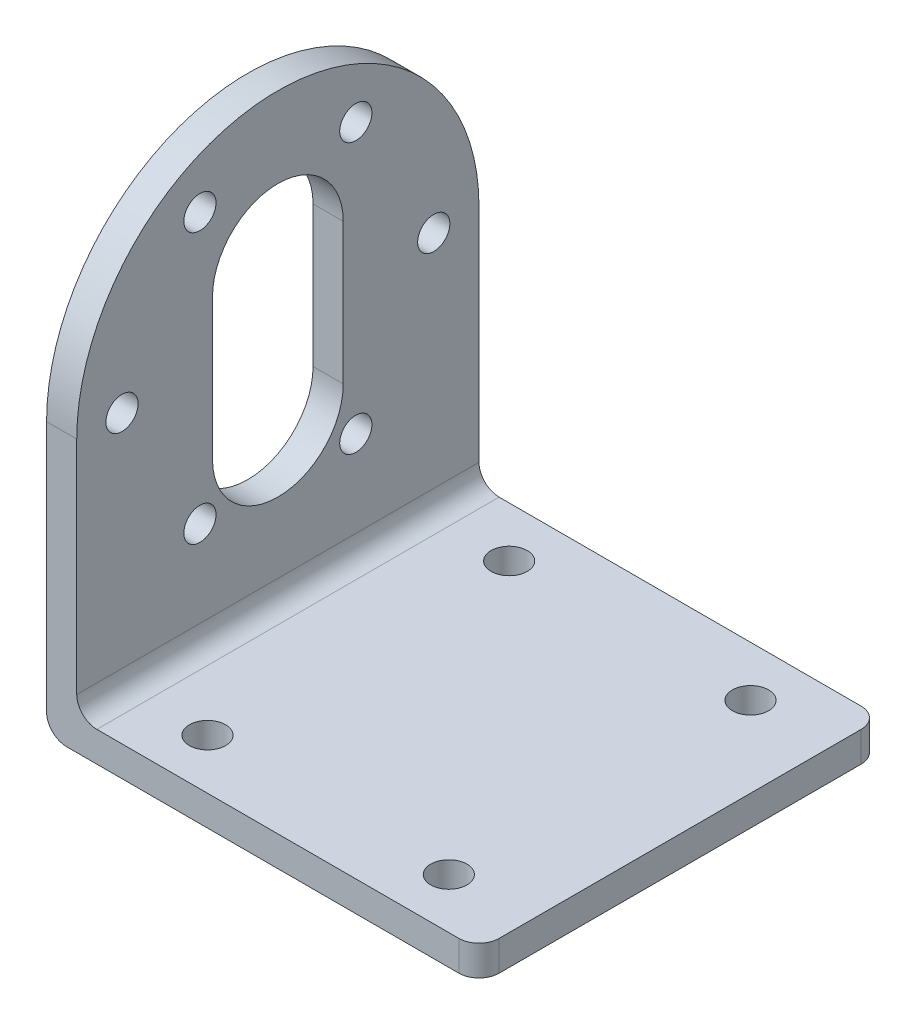
ISO-10303-21;
HEADER;
FILE_DESCRIPTION(('STEP AP214'),'2;1');
FILE_NAME('part.step','',(''),(''),'','','');
FILE_SCHEMA(('AUTOMOTIVE_DESIGN { 1 0 10303 214 1 1 1 1 }'));
ENDSEC;
DATA;
#1=APPLICATION_CONTEXT('core data for automotive mechanical design processes');
#2=APPLICATION_PROTOCOL_DEFINITION('international standard','automotive_design',2000,#1);
#3=PRODUCT_CONTEXT('',#1,'mechanical');
#4=PRODUCT('Part','Part','',(#3));
#5=PRODUCT_RELATED_PRODUCT_CATEGORY('part','',(#4));
#6=PRODUCT_DEFINITION_FORMATION('','',#4);
#7=PRODUCT_DEFINITION_CONTEXT('part definition',#1,'design');
#8=PRODUCT_DEFINITION('design','',#6,#7);
#9=PRODUCT_DEFINITION_SHAPE('','',#8);
#10=(LENGTH_UNIT() NAMED_UNIT(*) SI_UNIT(.MILLI.,.METRE.));
#11=(NAMED_UNIT(*) PLANE_ANGLE_UNIT() SI_UNIT($,.RADIAN.));
#12=(NAMED_UNIT(*) SI_UNIT($,.STERADIAN.) SOLID_ANGLE_UNIT());
#13=UNCERTAINTY_MEASURE_WITH_UNIT(LENGTH_MEASURE(1.E-05),#10,'distance_accuracy_value','');
#14=(GEOMETRIC_REPRESENTATION_CONTEXT(3) GLOBAL_UNCERTAINTY_ASSIGNED_CONTEXT((#13)) GLOBAL_UNIT_ASSIGNED_CONTEXT((#10,
#11,#12)) REPRESENTATION_CONTEXT('',''));
#15=CARTESIAN_POINT('',(0.,0.,0.));
#16=DIRECTION('',(0.,0.,1.));
#17=DIRECTION('',(1.,0.,0.));
#18=AXIS2_PLACEMENT_3D('',#15,#16,#17);
#19=CARTESIAN_POINT('',(3.,27.,0.));
#20=DIRECTION('',(-1.,0.,0.));
#21=DIRECTION('',(0.,0.,1.));
#22=AXIS2_PLACEMENT_3D('',#19,#20,#21);
#23=PLANE('',#22);
#24=CARTESIAN_POINT('',(3.,26.9999999999999,15.4999999999996));
#25=DIRECTION('',(1.,0.,0.));
#26=DIRECTION('',(0.,0.,-1.));
#27=AXIS2_PLACEMENT_3D('',#24,#25,#26);
#28=CIRCLE('',#27,1.6);
#29=CARTESIAN_POINT('',(3.,26.9999999999999,13.8999999999996));
#30=VERTEX_POINT('',#29);
#31=EDGE_CURVE('E187',#30,#30,#28,.T.);
#32=ORIENTED_EDGE('',*,*,#31,.F.);
#33=EDGE_LOOP('',(#32));
#34=FACE_BOUND('',#33,.T.);
#35=CARTESIAN_POINT('',(3.,13.5766062413413,7.74999999999934));
#36=DIRECTION('',(1.,0.,0.));
#37=DIRECTION('',(0.,0.,-1.));
#38=AXIS2_PLACEMENT_3D('',#35,#36,#37);
#39=CIRCLE('',#38,1.6);
#40=CARTESIAN_POINT('',(3.,13.5766062413413,6.14999999999934));
#41=VERTEX_POINT('',#40);
#42=EDGE_CURVE('E193',#41,#41,#39,.T.);
#43=ORIENTED_EDGE('',*,*,#42,.F.);
#44=EDGE_LOOP('',(#43));
#45=FACE_BOUND('',#44,.T.);
#46=CARTESIAN_POINT('',(3.,13.5766062413416,-7.75000000000069));
#47=DIRECTION('',(1.,0.,0.));
#48=DIRECTION('',(0.,0.,-1.));
#49=AXIS2_PLACEMENT_3D('',#46,#47,#48);
#50=CIRCLE('',#49,1.6);
#51=CARTESIAN_POINT('',(3.,13.5766062413416,-9.35000000000068));
#52=VERTEX_POINT('',#51);
#53=EDGE_CURVE('E199',#52,#52,#50,.T.);
#54=ORIENTED_EDGE('',*,*,#53,.F.);
#55=EDGE_LOOP('',(#54));
#56=FACE_BOUND('',#55,.T.);
#57=CARTESIAN_POINT('',(3.,27.0000000000006,-15.5000000000004));
#58=DIRECTION('',(1.,0.,0.));
#59=DIRECTION('',(0.,0.,-1.));
#60=AXIS2_PLACEMENT_3D('',#57,#58,#59);
#61=CIRCLE('',#60,1.6);
#62=CARTESIAN_POINT('',(3.,27.0000000000006,-17.1000000000004));
#63=VERTEX_POINT('',#62);
#64=EDGE_CURVE('E205',#63,#63,#61,.T.);
#65=ORIENTED_EDGE('',*,*,#64,.F.);
#66=EDGE_LOOP('',(#65));
#67=FACE_BOUND('',#66,.T.);
#68=CARTESIAN_POINT('',(3.,40.4233937586592,-7.75));
#69=DIRECTION('',(1.,0.,0.));
#70=DIRECTION('',(0.,0.,-1.));
#71=AXIS2_PLACEMENT_3D('',#68,#69,#70);
#72=CIRCLE('',#71,1.6);
#73=CARTESIAN_POINT('',(3.,40.4233937586592,-9.35));
#74=VERTEX_POINT('',#73);
#75=EDGE_CURVE('E211',#74,#74,#72,.T.);
#76=ORIENTED_EDGE('',*,*,#75,.F.);
#77=EDGE_LOOP('',(#76));
#78=FACE_BOUND('',#77,.T.);
#79=CARTESIAN_POINT('',(3.,40.4233937586588,7.75000000000002));
#80=DIRECTION('',(1.,0.,0.));
#81=DIRECTION('',(0.,0.,-1.));
#82=AXIS2_PLACEMENT_3D('',#79,#80,#81);
#83=CIRCLE('',#82,1.6);
#84=CARTESIAN_POINT('',(3.,40.4233937586588,6.15000000000003));
#85=VERTEX_POINT('',#84);
#86=EDGE_CURVE('E217',#85,#85,#83,.T.);
#87=ORIENTED_EDGE('',*,*,#86,.F.);
#88=EDGE_LOOP('',(#87));
#89=FACE_BOUND('',#88,.T.);
#90=CARTESIAN_POINT('',(3.,32.5,0.));
#91=DIRECTION('',(1.,0.,0.));
#92=DIRECTION('',(0.,0.,-1.));
#93=AXIS2_PLACEMENT_3D('',#90,#91,#92);
#94=CIRCLE('',#93,6.5);
#95=CARTESIAN_POINT('',(3.,32.5,-6.5));
#96=VERTEX_POINT('',#95);
#97=CARTESIAN_POINT('',(3.,32.5,6.5));
#98=VERTEX_POINT('',#97);
#99=EDGE_CURVE('E223',#96,#98,#94,.T.);
#100=ORIENTED_EDGE('',*,*,#99,.F.);
#101=DIRECTION('',(0.,1.,0.));
#102=VECTOR('',#101,1.);
#103=CARTESIAN_POINT('',(3.,32.5,-6.5));
#104=LINE('',#103,#102);
#105=CARTESIAN_POINT('',(3.,18.5,-6.5));
#106=VERTEX_POINT('',#105);
#107=EDGE_CURVE('E231',#106,#96,#104,.T.);
#108=ORIENTED_EDGE('',*,*,#107,.F.);
#109=CARTESIAN_POINT('',(3.,18.5,0.));
#110=DIRECTION('',(1.,0.,0.));
#111=DIRECTION('',(0.,0.,-1.));
#112=AXIS2_PLACEMENT_3D('',#109,#110,#111);
#113=CIRCLE('',#112,6.5);
#114=CARTESIAN_POINT('',(3.,18.5,6.5));
#115=VERTEX_POINT('',#114);
#116=EDGE_CURVE('E228',#115,#106,#113,.T.);
#117=ORIENTED_EDGE('',*,*,#116,.F.);
#118=DIRECTION('',(0.,-1.,0.));
#119=VECTOR('',#118,1.);
#120=CARTESIAN_POINT('',(3.,32.5,6.5));
#121=LINE('',#120,#119);
#122=EDGE_CURVE('E225',#98,#115,#121,.T.);
#123=ORIENTED_EDGE('',*,*,#122,.F.);
#124=EDGE_LOOP('',(#100,#108,#117,#123));
#125=FACE_BOUND('',#124,.T.);
#126=DIRECTION('',(0.,-1.,0.));
#127=VECTOR('',#126,1.);
#128=CARTESIAN_POINT('',(3.,0.,20.));
#129=LINE('',#128,#127);
#130=CARTESIAN_POINT('',(3.,27.,20.));
#131=VERTEX_POINT('',#130);
#132=CARTESIAN_POINT('',(3.,5.,20.));
#133=VERTEX_POINT('',#132);
#134=EDGE_CURVE('E259',#131,#133,#129,.T.);
#135=ORIENTED_EDGE('',*,*,#134,.T.);
#136=DIRECTION('',(0.,0.,1.));
#137=VECTOR('',#136,1.);
#138=CARTESIAN_POINT('',(3.,5.,-20.));
#139=LINE('',#138,#137);
#140=CARTESIAN_POINT('',(3.,5.,-20.));
#141=VERTEX_POINT('',#140);
#142=EDGE_CURVE('E279',#133,#141,#139,.F.);
#143=ORIENTED_EDGE('',*,*,#142,.T.);
#144=DIRECTION('',(0.,1.,0.));
#145=VECTOR('',#144,1.);
#146=CARTESIAN_POINT('',(3.,0.,-20.));
#147=LINE('',#146,#145);
#148=CARTESIAN_POINT('',(3.,27.,-20.));
#149=VERTEX_POINT('',#148);
#150=EDGE_CURVE('E254',#141,#149,#147,.T.);
#151=ORIENTED_EDGE('',*,*,#150,.T.);
#152=CARTESIAN_POINT('',(3.,27.,0.));
#153=DIRECTION('',(1.,0.,0.));
#154=DIRECTION('',(0.,0.,1.));
#155=AXIS2_PLACEMENT_3D('',#152,#153,#154);
#156=CIRCLE('',#155,20.);
#157=EDGE_CURVE('E256',#149,#131,#156,.T.);
#158=ORIENTED_EDGE('',*,*,#157,.T.);
#159=EDGE_LOOP('',(#135,#143,#151,#158));
#160=FACE_BOUND('',#159,.T.);
#161=ADVANCED_FACE('F37',(#34,#45,#56,#67,#78,#89,#125,#160),#23,.F.);
#162=CARTESIAN_POINT('',(0.,27.,0.));
#163=DIRECTION('',(-1.,0.,0.));
#164=DIRECTION('',(0.,0.,1.));
#165=AXIS2_PLACEMENT_3D('',#162,#163,#164);
#166=PLANE('',#165);
#167=DIRECTION('',(0.,1.,0.));
#168=VECTOR('',#167,1.);
#169=CARTESIAN_POINT('',(0.,0.,-20.));
#170=LINE('',#169,#168);
#171=CARTESIAN_POINT('',(0.,2.,-20.));
#172=VERTEX_POINT('',#171);
#173=CARTESIAN_POINT('',(0.,27.,-20.));
#174=VERTEX_POINT('',#173);
#175=EDGE_CURVE('E253',#172,#174,#170,.T.);
#176=ORIENTED_EDGE('',*,*,#175,.F.);
#177=DIRECTION('',(0.,0.,-1.));
#178=VECTOR('',#177,1.);
#179=CARTESIAN_POINT('',(0.,2.,20.));
#180=LINE('',#179,#178);
#181=CARTESIAN_POINT('',(0.,2.,20.));
#182=VERTEX_POINT('',#181);
#183=EDGE_CURVE('E52',#172,#182,#180,.F.);
#184=ORIENTED_EDGE('',*,*,#183,.T.);
#185=DIRECTION('',(0.,-1.,0.));
#186=VECTOR('',#185,1.);
#187=CARTESIAN_POINT('',(0.,0.,20.));
#188=LINE('',#187,#186);
#189=CARTESIAN_POINT('',(0.,27.,20.));
#190=VERTEX_POINT('',#189);
#191=EDGE_CURVE('E257',#190,#182,#188,.T.);
#192=ORIENTED_EDGE('',*,*,#191,.F.);
#193=CARTESIAN_POINT('',(0.,27.,0.));
#194=DIRECTION('',(1.,0.,0.));
#195=DIRECTION('',(0.,0.,1.));
#196=AXIS2_PLACEMENT_3D('',#193,#194,#195);
#197=CIRCLE('',#196,20.);
#198=EDGE_CURVE('E264',#174,#190,#197,.T.);
#199=ORIENTED_EDGE('',*,*,#198,.F.);
#200=EDGE_LOOP('',(#176,#184,#192,#199));
#201=FACE_BOUND('',#200,.T.);
#202=CARTESIAN_POINT('',(0.,13.5766062413413,7.74999999999934));
#203=DIRECTION('',(1.,0.,0.));
#204=DIRECTION('',(0.,0.,-1.));
#205=AXIS2_PLACEMENT_3D('',#202,#203,#204);
#206=CIRCLE('',#205,1.6);
#207=CARTESIAN_POINT('',(0.,13.5766062413413,6.14999999999934));
#208=VERTEX_POINT('',#207);
#209=EDGE_CURVE('E190',#208,#208,#206,.T.);
#210=ORIENTED_EDGE('',*,*,#209,.T.);
#211=EDGE_LOOP('',(#210));
#212=FACE_BOUND('',#211,.T.);
#213=CARTESIAN_POINT('',(0.,27.0000000000006,-15.5000000000004));
#214=DIRECTION('',(1.,0.,0.));
#215=DIRECTION('',(0.,0.,-1.));
#216=AXIS2_PLACEMENT_3D('',#213,#214,#215);
#217=CIRCLE('',#216,1.6);
#218=CARTESIAN_POINT('',(0.,27.0000000000006,-17.1000000000004));
#219=VERTEX_POINT('',#218);
#220=EDGE_CURVE('E202',#219,#219,#217,.T.);
#221=ORIENTED_EDGE('',*,*,#220,.T.);
#222=EDGE_LOOP('',(#221));
#223=FACE_BOUND('',#222,.T.);
#224=CARTESIAN_POINT('',(0.,40.4233937586588,7.75000000000002));
#225=DIRECTION('',(1.,0.,0.));
#226=DIRECTION('',(0.,0.,-1.));
#227=AXIS2_PLACEMENT_3D('',#224,#225,#226);
#228=CIRCLE('',#227,1.6);
#229=CARTESIAN_POINT('',(0.,40.4233937586588,6.15000000000003));
#230=VERTEX_POINT('',#229);
#231=EDGE_CURVE('E214',#230,#230,#228,.T.);
#232=ORIENTED_EDGE('',*,*,#231,.T.);
#233=EDGE_LOOP('',(#232));
#234=FACE_BOUND('',#233,.T.);
#235=DIRECTION('',(0.,1.,0.));
#236=VECTOR('',#235,1.);
#237=CARTESIAN_POINT('',(0.,32.5,-6.5));
#238=LINE('',#237,#236);
#239=CARTESIAN_POINT('',(0.,18.5,-6.5));
#240=VERTEX_POINT('',#239);
#241=CARTESIAN_POINT('',(0.,32.5,-6.5));
#242=VERTEX_POINT('',#241);
#243=EDGE_CURVE('E226',#240,#242,#238,.T.);
#244=ORIENTED_EDGE('',*,*,#243,.T.);
#245=CARTESIAN_POINT('',(0.,32.5,0.));
#246=DIRECTION('',(1.,0.,0.));
#247=DIRECTION('',(0.,0.,-1.));
#248=AXIS2_PLACEMENT_3D('',#245,#246,#247);
#249=CIRCLE('',#248,6.5);
#250=CARTESIAN_POINT('',(0.,32.5,6.5));
#251=VERTEX_POINT('',#250);
#252=EDGE_CURVE('E220',#242,#251,#249,.T.);
#253=ORIENTED_EDGE('',*,*,#252,.T.);
#254=DIRECTION('',(0.,-1.,0.));
#255=VECTOR('',#254,1.);
#256=CARTESIAN_POINT('',(0.,32.5,6.5));
#257=LINE('',#256,#255);
#258=CARTESIAN_POINT('',(0.,18.5,6.5));
#259=VERTEX_POINT('',#258);
#260=EDGE_CURVE('E236',#251,#259,#257,.T.);
#261=ORIENTED_EDGE('',*,*,#260,.T.);
#262=CARTESIAN_POINT('',(0.,18.5,0.));
#263=DIRECTION('',(1.,0.,0.));
#264=DIRECTION('',(0.,0.,-1.));
#265=AXIS2_PLACEMENT_3D('',#262,#263,#264);
#266=CIRCLE('',#265,6.5);
#267=EDGE_CURVE('E239',#259,#240,#266,.T.);
#268=ORIENTED_EDGE('',*,*,#267,.T.);
#269=EDGE_LOOP('',(#244,#253,#261,#268));
#270=FACE_BOUND('',#269,.T.);
#271=CARTESIAN_POINT('',(0.,40.4233937586592,-7.75));
#272=DIRECTION('',(1.,0.,0.));
#273=DIRECTION('',(0.,0.,-1.));
#274=AXIS2_PLACEMENT_3D('',#271,#272,#273);
#275=CIRCLE('',#274,1.6);
#276=CARTESIAN_POINT('',(0.,40.4233937586592,-9.35));
#277=VERTEX_POINT('',#276);
#278=EDGE_CURVE('E208',#277,#277,#275,.T.);
#279=ORIENTED_EDGE('',*,*,#278,.T.);
#280=EDGE_LOOP('',(#279));
#281=FACE_BOUND('',#280,.T.);
#282=CARTESIAN_POINT('',(0.,13.5766062413416,-7.75000000000069));
#283=DIRECTION('',(1.,0.,0.));
#284=DIRECTION('',(0.,0.,-1.));
#285=AXIS2_PLACEMENT_3D('',#282,#283,#284);
#286=CIRCLE('',#285,1.6);
#287=CARTESIAN_POINT('',(0.,13.5766062413416,-9.35000000000068));
#288=VERTEX_POINT('',#287);
#289=EDGE_CURVE('E196',#288,#288,#286,.T.);
#290=ORIENTED_EDGE('',*,*,#289,.T.);
#291=EDGE_LOOP('',(#290));
#292=FACE_BOUND('',#291,.T.);
#293=CARTESIAN_POINT('',(0.,26.9999999999999,15.4999999999996));
#294=DIRECTION('',(1.,0.,0.));
#295=DIRECTION('',(0.,0.,-1.));
#296=AXIS2_PLACEMENT_3D('',#293,#294,#295);
#297=CIRCLE('',#296,1.6);
#298=CARTESIAN_POINT('',(0.,26.9999999999999,13.8999999999996));
#299=VERTEX_POINT('',#298);
#300=EDGE_CURVE('E183',#299,#299,#297,.T.);
#301=ORIENTED_EDGE('',*,*,#300,.T.);
#302=EDGE_LOOP('',(#301));
#303=FACE_BOUND('',#302,.T.);
#304=ADVANCED_FACE('F309',(#201,#212,#223,#234,#270,#281,#292,#303),#166,.T.);
#305=CARTESIAN_POINT('',(3.,0.,-20.));
#306=DIRECTION('',(0.,0.,1.));
#307=DIRECTION('',(0.,-1.,0.));
#308=AXIS2_PLACEMENT_3D('',#305,#306,#307);
#309=PLANE('',#308);
#310=DIRECTION('',(-1.,0.,0.));
#311=VECTOR('',#310,1.);
#312=CARTESIAN_POINT('',(3.,0.,-20.));
#313=LINE('',#312,#311);
#314=CARTESIAN_POINT('',(41.,0.,-20.));
#315=VERTEX_POINT('',#314);
#316=CARTESIAN_POINT('',(2.,0.,-20.));
#317=VERTEX_POINT('',#316);
#318=EDGE_CURVE('E262',#315,#317,#313,.T.);
#319=ORIENTED_EDGE('',*,*,#318,.T.);
#320=CARTESIAN_POINT('',(2.,2.,-20.));
#321=DIRECTION('',(0.,0.,1.));
#322=DIRECTION('',(0.,-1.,0.));
#323=AXIS2_PLACEMENT_3D('',#320,#321,#322);
#324=CIRCLE('',#323,2.);
#325=EDGE_CURVE('E60',#317,#172,#324,.F.);
#326=ORIENTED_EDGE('',*,*,#325,.T.);
#327=ORIENTED_EDGE('',*,*,#175,.T.);
#328=DIRECTION('',(-1.,0.,0.));
#329=VECTOR('',#328,1.);
#330=CARTESIAN_POINT('',(3.,27.,-20.));
#331=LINE('',#330,#329);
#332=EDGE_CURVE('E274',#149,#174,#331,.T.);
#333=ORIENTED_EDGE('',*,*,#332,.F.);
#334=ORIENTED_EDGE('',*,*,#150,.F.);
#335=CARTESIAN_POINT('',(5.,5.,-20.));
#336=DIRECTION('',(0.,0.,1.));
#337=DIRECTION('',(0.,-1.,0.));
#338=AXIS2_PLACEMENT_3D('',#335,#336,#337);
#339=CIRCLE('',#338,2.);
#340=CARTESIAN_POINT('',(5.,3.,-20.));
#341=VERTEX_POINT('',#340);
#342=EDGE_CURVE('E11',#141,#341,#339,.T.);
#343=ORIENTED_EDGE('',*,*,#342,.T.);
#344=DIRECTION('',(1.,0.,0.));
#345=VECTOR('',#344,1.);
#346=CARTESIAN_POINT('',(0.,3.,-20.));
#347=LINE('',#346,#345);
#348=CARTESIAN_POINT('',(41.,3.,-20.));
#349=VERTEX_POINT('',#348);
#350=EDGE_CURVE('E137',#341,#349,#347,.T.);
#351=ORIENTED_EDGE('',*,*,#350,.T.);
#352=DIRECTION('',(0.,-1.,0.));
#353=VECTOR('',#352,1.);
#354=CARTESIAN_POINT('',(41.,3.,-20.));
#355=LINE('',#354,#353);
#356=EDGE_CURVE('E140',#349,#315,#355,.T.);
#357=ORIENTED_EDGE('',*,*,#356,.T.);
#358=EDGE_LOOP('',(#319,#326,#327,#333,#334,#343,#351,#357));
#359=FACE_BOUND('',#358,.T.);
#360=ADVANCED_FACE('F139',(#359),#309,.F.);
#361=CARTESIAN_POINT('',(3.,27.,0.));
#362=DIRECTION('',(-1.,0.,0.));
#363=DIRECTION('',(0.,0.,1.));
#364=AXIS2_PLACEMENT_3D('',#361,#362,#363);
#365=CYLINDRICAL_SURFACE('',#364,20.);
#366=ORIENTED_EDGE('',*,*,#198,.T.);
#367=DIRECTION('',(-1.,0.,0.));
#368=VECTOR('',#367,1.);
#369=CARTESIAN_POINT('',(3.,27.,20.));
#370=LINE('',#369,#368);
#371=EDGE_CURVE('E271',#131,#190,#370,.T.);
#372=ORIENTED_EDGE('',*,*,#371,.F.);
#373=ORIENTED_EDGE('',*,*,#157,.F.);
#374=ORIENTED_EDGE('',*,*,#332,.T.);
#375=EDGE_LOOP('',(#366,#372,#373,#374));
#376=FACE_BOUND('',#375,.T.);
#377=ADVANCED_FACE('F313',(#376),#365,.T.);
#378=CARTESIAN_POINT('',(3.,0.,20.));
#379=DIRECTION('',(0.,0.,-1.));
#380=DIRECTION('',(0.,1.,0.));
#381=AXIS2_PLACEMENT_3D('',#378,#379,#380);
#382=PLANE('',#381);
#383=ORIENTED_EDGE('',*,*,#191,.T.);
#384=CARTESIAN_POINT('',(2.,2.,20.));
#385=DIRECTION('',(0.,0.,-1.));
#386=DIRECTION('',(0.,1.,0.));
#387=AXIS2_PLACEMENT_3D('',#384,#385,#386);
#388=CIRCLE('',#387,2.);
#389=CARTESIAN_POINT('',(2.,0.,20.));
#390=VERTEX_POINT('',#389);
#391=EDGE_CURVE('E286',#182,#390,#388,.F.);
#392=ORIENTED_EDGE('',*,*,#391,.T.);
#393=DIRECTION('',(-1.,0.,0.));
#394=VECTOR('',#393,1.);
#395=CARTESIAN_POINT('',(3.,0.,20.));
#396=LINE('',#395,#394);
#397=CARTESIAN_POINT('',(41.,0.,20.));
#398=VERTEX_POINT('',#397);
#399=EDGE_CURVE('E268',#398,#390,#396,.T.);
#400=ORIENTED_EDGE('',*,*,#399,.F.);
#401=DIRECTION('',(0.,-1.,0.));
#402=VECTOR('',#401,1.);
#403=CARTESIAN_POINT('',(41.,3.,20.));
#404=LINE('',#403,#402);
#405=CARTESIAN_POINT('',(41.,3.,20.));
#406=VERTEX_POINT('',#405);
#407=EDGE_CURVE('E180',#406,#398,#404,.T.);
#408=ORIENTED_EDGE('',*,*,#407,.F.);
#409=DIRECTION('',(-1.,0.,0.));
#410=VECTOR('',#409,1.);
#411=CARTESIAN_POINT('',(0.,3.,20.));
#412=LINE('',#411,#410);
#413=CARTESIAN_POINT('',(5.,3.,20.));
#414=VERTEX_POINT('',#413);
#415=EDGE_CURVE('E157',#406,#414,#412,.T.);
#416=ORIENTED_EDGE('',*,*,#415,.T.);
#417=CARTESIAN_POINT('',(5.,5.,20.));
#418=DIRECTION('',(0.,0.,-1.));
#419=DIRECTION('',(0.,1.,0.));
#420=AXIS2_PLACEMENT_3D('',#417,#418,#419);
#421=CIRCLE('',#420,2.);
#422=EDGE_CURVE('E45',#414,#133,#421,.T.);
#423=ORIENTED_EDGE('',*,*,#422,.T.);
#424=ORIENTED_EDGE('',*,*,#134,.F.);
#425=ORIENTED_EDGE('',*,*,#371,.T.);
#426=EDGE_LOOP('',(#383,#392,#400,#408,#416,#423,#424,#425));
#427=FACE_BOUND('',#426,.T.);
#428=ADVANCED_FACE('F289',(#427),#382,.F.);
#429=CARTESIAN_POINT('',(3.,0.,20.));
#430=DIRECTION('',(0.,1.,0.));
#431=DIRECTION('',(0.,0.,1.));
#432=AXIS2_PLACEMENT_3D('',#429,#430,#431);
#433=PLANE('',#432);
#434=ORIENTED_EDGE('',*,*,#399,.T.);
#435=DIRECTION('',(0.,0.,-1.));
#436=VECTOR('',#435,1.);
#437=CARTESIAN_POINT('',(2.,0.,-20.));
#438=LINE('',#437,#436);
#439=EDGE_CURVE('E281',#390,#317,#438,.T.);
#440=ORIENTED_EDGE('',*,*,#439,.T.);
#441=ORIENTED_EDGE('',*,*,#318,.F.);
#442=CARTESIAN_POINT('',(41.,0.,-18.));
#443=DIRECTION('',(0.,-1.,0.));
#444=DIRECTION('',(0.,0.,-1.));
#445=AXIS2_PLACEMENT_3D('',#442,#443,#444);
#446=CIRCLE('',#445,2.);
#447=CARTESIAN_POINT('',(43.,0.,-18.));
#448=VERTEX_POINT('',#447);
#449=EDGE_CURVE('E155',#315,#448,#446,.T.);
#450=ORIENTED_EDGE('',*,*,#449,.T.);
#451=DIRECTION('',(0.,0.,1.));
#452=VECTOR('',#451,1.);
#453=CARTESIAN_POINT('',(43.,0.,18.));
#454=LINE('',#453,#452);
#455=CARTESIAN_POINT('',(43.,0.,18.));
#456=VERTEX_POINT('',#455);
#457=EDGE_CURVE('E174',#448,#456,#454,.T.);
#458=ORIENTED_EDGE('',*,*,#457,.T.);
#459=CARTESIAN_POINT('',(41.,0.,18.));
#460=DIRECTION('',(0.,-1.,0.));
#461=DIRECTION('',(0.,0.,1.));
#462=AXIS2_PLACEMENT_3D('',#459,#460,#461);
#463=CIRCLE('',#462,2.);
#464=EDGE_CURVE('E149',#456,#398,#463,.T.);
#465=ORIENTED_EDGE('',*,*,#464,.T.);
#466=EDGE_LOOP('',(#434,#440,#441,#450,#458,#465));
#467=FACE_BOUND('',#466,.T.);
#468=CARTESIAN_POINT('',(11.,0.,15.));
#469=DIRECTION('',(0.,-1.,0.));
#470=DIRECTION('',(0.,0.,-1.));
#471=AXIS2_PLACEMENT_3D('',#468,#469,#470);
#472=CIRCLE('',#471,1.8);
#473=CARTESIAN_POINT('',(11.,0.,13.2));
#474=VERTEX_POINT('',#473);
#475=EDGE_CURVE('E441',#474,#474,#472,.T.);
#476=ORIENTED_EDGE('',*,*,#475,.F.);
#477=EDGE_LOOP('',(#476));
#478=FACE_BOUND('',#477,.T.);
#479=CARTESIAN_POINT('',(35.,0.,15.));
#480=DIRECTION('',(0.,-1.,0.));
#481=DIRECTION('',(0.,0.,-1.));
#482=AXIS2_PLACEMENT_3D('',#479,#480,#481);
#483=CIRCLE('',#482,1.8);
#484=CARTESIAN_POINT('',(35.,0.,13.2));
#485=VERTEX_POINT('',#484);
#486=EDGE_CURVE('E435',#485,#485,#483,.T.);
#487=ORIENTED_EDGE('',*,*,#486,.F.);
#488=EDGE_LOOP('',(#487));
#489=FACE_BOUND('',#488,.T.);
#490=CARTESIAN_POINT('',(11.,0.,-15.));
#491=DIRECTION('',(0.,-1.,0.));
#492=DIRECTION('',(0.,0.,-1.));
#493=AXIS2_PLACEMENT_3D('',#490,#491,#492);
#494=CIRCLE('',#493,1.8);
#495=CARTESIAN_POINT('',(11.,0.,-16.8));
#496=VERTEX_POINT('',#495);
#497=EDGE_CURVE('E429',#496,#496,#494,.T.);
#498=ORIENTED_EDGE('',*,*,#497,.F.);
#499=EDGE_LOOP('',(#498));
#500=FACE_BOUND('',#499,.T.);
#501=CARTESIAN_POINT('',(35.,0.,-15.));
#502=DIRECTION('',(0.,-1.,0.));
#503=DIRECTION('',(0.,0.,-1.));
#504=AXIS2_PLACEMENT_3D('',#501,#502,#503);
#505=CIRCLE('',#504,1.8);
#506=CARTESIAN_POINT('',(35.,0.,-16.8));
#507=VERTEX_POINT('',#506);
#508=EDGE_CURVE('E426',#507,#507,#505,.T.);
#509=ORIENTED_EDGE('',*,*,#508,.F.);
#510=EDGE_LOOP('',(#509));
#511=FACE_BOUND('',#510,.T.);
#512=ADVANCED_FACE('F303',(#467,#478,#489,#500,#511),#433,.F.);
#513=CARTESIAN_POINT('',(3.,32.5,0.));
#514=DIRECTION('',(-1.,0.,0.));
#515=DIRECTION('',(0.,0.,1.));
#516=AXIS2_PLACEMENT_3D('',#513,#514,#515);
#517=CYLINDRICAL_SURFACE('',#516,6.5);
#518=ORIENTED_EDGE('',*,*,#252,.F.);
#519=DIRECTION('',(-1.,0.,0.));
#520=VECTOR('',#519,1.);
#521=CARTESIAN_POINT('',(3.,32.5,-6.5));
#522=LINE('',#521,#520);
#523=EDGE_CURVE('E233',#96,#242,#522,.T.);
#524=ORIENTED_EDGE('',*,*,#523,.F.);
#525=ORIENTED_EDGE('',*,*,#99,.T.);
#526=DIRECTION('',(-1.,0.,0.));
#527=VECTOR('',#526,1.);
#528=CARTESIAN_POINT('',(3.,32.5,6.5));
#529=LINE('',#528,#527);
#530=EDGE_CURVE('E250',#98,#251,#529,.T.);
#531=ORIENTED_EDGE('',*,*,#530,.T.);
#532=EDGE_LOOP('',(#518,#524,#525,#531));
#533=FACE_BOUND('',#532,.T.);
#534=ADVANCED_FACE('F332',(#533),#517,.F.);
#535=CARTESIAN_POINT('',(3.,32.5,6.5));
#536=DIRECTION('',(0.,0.,-1.));
#537=DIRECTION('',(-1.,0.,0.));
#538=AXIS2_PLACEMENT_3D('',#535,#536,#537);
#539=PLANE('',#538);
#540=ORIENTED_EDGE('',*,*,#260,.F.);
#541=ORIENTED_EDGE('',*,*,#530,.F.);
#542=ORIENTED_EDGE('',*,*,#122,.T.);
#543=DIRECTION('',(-1.,0.,0.));
#544=VECTOR('',#543,1.);
#545=CARTESIAN_POINT('',(3.,18.5,6.5));
#546=LINE('',#545,#544);
#547=EDGE_CURVE('E248',#115,#259,#546,.T.);
#548=ORIENTED_EDGE('',*,*,#547,.T.);
#549=EDGE_LOOP('',(#540,#541,#542,#548));
#550=FACE_BOUND('',#549,.T.);
#551=ADVANCED_FACE('F339',(#550),#539,.T.);
#552=CARTESIAN_POINT('',(3.,18.5,0.));
#553=DIRECTION('',(-1.,0.,0.));
#554=DIRECTION('',(0.,0.,1.));
#555=AXIS2_PLACEMENT_3D('',#552,#553,#554);
#556=CYLINDRICAL_SURFACE('',#555,6.5);
#557=ORIENTED_EDGE('',*,*,#267,.F.);
#558=ORIENTED_EDGE('',*,*,#547,.F.);
#559=ORIENTED_EDGE('',*,*,#116,.T.);
#560=DIRECTION('',(-1.,0.,0.));
#561=VECTOR('',#560,1.);
#562=CARTESIAN_POINT('',(3.,18.5,-6.5));
#563=LINE('',#562,#561);
#564=EDGE_CURVE('E246',#106,#240,#563,.T.);
#565=ORIENTED_EDGE('',*,*,#564,.T.);
#566=EDGE_LOOP('',(#557,#558,#559,#565));
#567=FACE_BOUND('',#566,.T.);
#568=ADVANCED_FACE('F344',(#567),#556,.F.);
#569=CARTESIAN_POINT('',(3.,32.5,-6.5));
#570=DIRECTION('',(0.,0.,1.));
#571=DIRECTION('',(0.,-1.,0.));
#572=AXIS2_PLACEMENT_3D('',#569,#570,#571);
#573=PLANE('',#572);
#574=ORIENTED_EDGE('',*,*,#243,.F.);
#575=ORIENTED_EDGE('',*,*,#564,.F.);
#576=ORIENTED_EDGE('',*,*,#107,.T.);
#577=ORIENTED_EDGE('',*,*,#523,.T.);
#578=EDGE_LOOP('',(#574,#575,#576,#577));
#579=FACE_BOUND('',#578,.T.);
#580=ADVANCED_FACE('F352',(#579),#573,.T.);
#581=CARTESIAN_POINT('',(3.,40.4233937586588,7.75000000000002));
#582=DIRECTION('',(-1.,0.,0.));
#583=DIRECTION('',(0.,0.,1.));
#584=AXIS2_PLACEMENT_3D('',#581,#582,#583);
#585=CYLINDRICAL_SURFACE('',#584,1.6);
#586=ORIENTED_EDGE('',*,*,#86,.T.);
#587=EDGE_LOOP('',(#586));
#588=FACE_BOUND('',#587,.T.);
#589=ORIENTED_EDGE('',*,*,#231,.F.);
#590=EDGE_LOOP('',(#589));
#591=FACE_BOUND('',#590,.T.);
#592=ADVANCED_FACE('F366',(#588,#591),#585,.F.);
#593=CARTESIAN_POINT('',(3.,40.4233937586592,-7.75));
#594=DIRECTION('',(-1.,0.,0.));
#595=DIRECTION('',(0.,0.,1.));
#596=AXIS2_PLACEMENT_3D('',#593,#594,#595);
#597=CYLINDRICAL_SURFACE('',#596,1.6);
#598=ORIENTED_EDGE('',*,*,#75,.T.);
#599=EDGE_LOOP('',(#598));
#600=FACE_BOUND('',#599,.T.);
#601=ORIENTED_EDGE('',*,*,#278,.F.);
#602=EDGE_LOOP('',(#601));
#603=FACE_BOUND('',#602,.T.);
#604=ADVANCED_FACE('F371',(#600,#603),#597,.F.);
#605=CARTESIAN_POINT('',(3.,27.0000000000006,-15.5000000000004));
#606=DIRECTION('',(-1.,0.,0.));
#607=DIRECTION('',(0.,0.,1.));
#608=AXIS2_PLACEMENT_3D('',#605,#606,#607);
#609=CYLINDRICAL_SURFACE('',#608,1.6);
#610=ORIENTED_EDGE('',*,*,#64,.T.);
#611=EDGE_LOOP('',(#610));
#612=FACE_BOUND('',#611,.T.);
#613=ORIENTED_EDGE('',*,*,#220,.F.);
#614=EDGE_LOOP('',(#613));
#615=FACE_BOUND('',#614,.T.);
#616=ADVANCED_FACE('F375',(#612,#615),#609,.F.);
#617=CARTESIAN_POINT('',(3.,13.5766062413416,-7.75000000000069));
#618=DIRECTION('',(-1.,0.,0.));
#619=DIRECTION('',(0.,0.,1.));
#620=AXIS2_PLACEMENT_3D('',#617,#618,#619);
#621=CYLINDRICAL_SURFACE('',#620,1.6);
#622=ORIENTED_EDGE('',*,*,#53,.T.);
#623=EDGE_LOOP('',(#622));
#624=FACE_BOUND('',#623,.T.);
#625=ORIENTED_EDGE('',*,*,#289,.F.);
#626=EDGE_LOOP('',(#625));
#627=FACE_BOUND('',#626,.T.);
#628=ADVANCED_FACE('F379',(#624,#627),#621,.F.);
#629=CARTESIAN_POINT('',(3.,13.5766062413413,7.74999999999934));
#630=DIRECTION('',(-1.,0.,0.));
#631=DIRECTION('',(0.,0.,1.));
#632=AXIS2_PLACEMENT_3D('',#629,#630,#631);
#633=CYLINDRICAL_SURFACE('',#632,1.6);
#634=ORIENTED_EDGE('',*,*,#42,.T.);
#635=EDGE_LOOP('',(#634));
#636=FACE_BOUND('',#635,.T.);
#637=ORIENTED_EDGE('',*,*,#209,.F.);
#638=EDGE_LOOP('',(#637));
#639=FACE_BOUND('',#638,.T.);
#640=ADVANCED_FACE('F383',(#636,#639),#633,.F.);
#641=CARTESIAN_POINT('',(3.,26.9999999999999,15.4999999999996));
#642=DIRECTION('',(-1.,0.,0.));
#643=DIRECTION('',(0.,0.,1.));
#644=AXIS2_PLACEMENT_3D('',#641,#642,#643);
#645=CYLINDRICAL_SURFACE('',#644,1.6);
#646=ORIENTED_EDGE('',*,*,#31,.T.);
#647=EDGE_LOOP('',(#646));
#648=FACE_BOUND('',#647,.T.);
#649=ORIENTED_EDGE('',*,*,#300,.F.);
#650=EDGE_LOOP('',(#649));
#651=FACE_BOUND('',#650,.T.);
#652=ADVANCED_FACE('F387',(#648,#651),#645,.F.);
#653=CARTESIAN_POINT('',(41.,3.,-18.));
#654=DIRECTION('',(0.,-1.,0.));
#655=DIRECTION('',(0.,0.,-1.));
#656=AXIS2_PLACEMENT_3D('',#653,#654,#655);
#657=PLANE('',#656);
#658=CARTESIAN_POINT('',(35.,3.,-15.));
#659=DIRECTION('',(0.,-1.,0.));
#660=DIRECTION('',(0.,0.,-1.));
#661=AXIS2_PLACEMENT_3D('',#658,#659,#660);
#662=CIRCLE('',#661,1.8);
#663=CARTESIAN_POINT('',(35.,3.,-16.8));
#664=VERTEX_POINT('',#663);
#665=EDGE_CURVE('E423',#664,#664,#662,.T.);
#666=ORIENTED_EDGE('',*,*,#665,.T.);
#667=EDGE_LOOP('',(#666));
#668=FACE_BOUND('',#667,.T.);
#669=CARTESIAN_POINT('',(11.,3.,-15.));
#670=DIRECTION('',(0.,-1.,0.));
#671=DIRECTION('',(0.,0.,-1.));
#672=AXIS2_PLACEMENT_3D('',#669,#670,#671);
#673=CIRCLE('',#672,1.8);
#674=CARTESIAN_POINT('',(11.,3.,-16.8));
#675=VERTEX_POINT('',#674);
#676=EDGE_CURVE('E432',#675,#675,#673,.T.);
#677=ORIENTED_EDGE('',*,*,#676,.T.);
#678=EDGE_LOOP('',(#677));
#679=FACE_BOUND('',#678,.T.);
#680=CARTESIAN_POINT('',(35.,3.,15.));
#681=DIRECTION('',(0.,-1.,0.));
#682=DIRECTION('',(0.,0.,-1.));
#683=AXIS2_PLACEMENT_3D('',#680,#681,#682);
#684=CIRCLE('',#683,1.8);
#685=CARTESIAN_POINT('',(35.,3.,13.2));
#686=VERTEX_POINT('',#685);
#687=EDGE_CURVE('E438',#686,#686,#684,.T.);
#688=ORIENTED_EDGE('',*,*,#687,.T.);
#689=EDGE_LOOP('',(#688));
#690=FACE_BOUND('',#689,.T.);
#691=CARTESIAN_POINT('',(11.,3.,15.));
#692=DIRECTION('',(0.,-1.,0.));
#693=DIRECTION('',(0.,0.,-1.));
#694=AXIS2_PLACEMENT_3D('',#691,#692,#693);
#695=CIRCLE('',#694,1.8);
#696=CARTESIAN_POINT('',(11.,3.,13.2));
#697=VERTEX_POINT('',#696);
#698=EDGE_CURVE('E175',#697,#697,#695,.T.);
#699=ORIENTED_EDGE('',*,*,#698,.T.);
#700=EDGE_LOOP('',(#699));
#701=FACE_BOUND('',#700,.T.);
#702=ORIENTED_EDGE('',*,*,#350,.F.);
#703=DIRECTION('',(0.,0.,1.));
#704=VECTOR('',#703,1.);
#705=CARTESIAN_POINT('',(5.,3.,20.));
#706=LINE('',#705,#704);
#707=EDGE_CURVE('E277',#341,#414,#706,.T.);
#708=ORIENTED_EDGE('',*,*,#707,.T.);
#709=ORIENTED_EDGE('',*,*,#415,.F.);
#710=CARTESIAN_POINT('',(41.,3.,18.));
#711=DIRECTION('',(0.,-1.,0.));
#712=DIRECTION('',(0.,0.,1.));
#713=AXIS2_PLACEMENT_3D('',#710,#711,#712);
#714=CIRCLE('',#713,2.);
#715=CARTESIAN_POINT('',(43.,3.,18.));
#716=VERTEX_POINT('',#715);
#717=EDGE_CURVE('E165',#716,#406,#714,.T.);
#718=ORIENTED_EDGE('',*,*,#717,.F.);
#719=DIRECTION('',(0.,0.,1.));
#720=VECTOR('',#719,1.);
#721=CARTESIAN_POINT('',(43.,3.,18.));
#722=LINE('',#721,#720);
#723=CARTESIAN_POINT('',(43.,3.,-18.));
#724=VERTEX_POINT('',#723);
#725=EDGE_CURVE('E163',#724,#716,#722,.T.);
#726=ORIENTED_EDGE('',*,*,#725,.F.);
#727=CARTESIAN_POINT('',(41.,3.,-18.));
#728=DIRECTION('',(0.,-1.,0.));
#729=DIRECTION('',(0.,0.,-1.));
#730=AXIS2_PLACEMENT_3D('',#727,#728,#729);
#731=CIRCLE('',#730,2.);
#732=EDGE_CURVE('E148',#349,#724,#731,.T.);
#733=ORIENTED_EDGE('',*,*,#732,.F.);
#734=EDGE_LOOP('',(#702,#708,#709,#718,#726,#733));
#735=FACE_BOUND('',#734,.T.);
#736=ADVANCED_FACE('F160',(#668,#679,#690,#701,#735),#657,.F.);
#737=CARTESIAN_POINT('',(41.,3.,18.));
#738=DIRECTION('',(0.,-1.,0.));
#739=DIRECTION('',(0.,0.,-1.));
#740=AXIS2_PLACEMENT_3D('',#737,#738,#739);
#741=CYLINDRICAL_SURFACE('',#740,2.);
#742=ORIENTED_EDGE('',*,*,#464,.F.);
#743=DIRECTION('',(0.,-1.,0.));
#744=VECTOR('',#743,1.);
#745=CARTESIAN_POINT('',(43.,3.,18.));
#746=LINE('',#745,#744);
#747=EDGE_CURVE('E184',#716,#456,#746,.T.);
#748=ORIENTED_EDGE('',*,*,#747,.F.);
#749=ORIENTED_EDGE('',*,*,#717,.T.);
#750=ORIENTED_EDGE('',*,*,#407,.T.);
#751=EDGE_LOOP('',(#742,#748,#749,#750));
#752=FACE_BOUND('',#751,.T.);
#753=ADVANCED_FACE('F397',(#752),#741,.T.);
#754=CARTESIAN_POINT('',(43.,3.,18.));
#755=DIRECTION('',(1.,0.,0.));
#756=DIRECTION('',(0.,0.,-1.));
#757=AXIS2_PLACEMENT_3D('',#754,#755,#756);
#758=PLANE('',#757);
#759=ORIENTED_EDGE('',*,*,#457,.F.);
#760=DIRECTION('',(0.,-1.,0.));
#761=VECTOR('',#760,1.);
#762=CARTESIAN_POINT('',(43.,3.,-18.));
#763=LINE('',#762,#761);
#764=EDGE_CURVE('E156',#724,#448,#763,.T.);
#765=ORIENTED_EDGE('',*,*,#764,.F.);
#766=ORIENTED_EDGE('',*,*,#725,.T.);
#767=ORIENTED_EDGE('',*,*,#747,.T.);
#768=EDGE_LOOP('',(#759,#765,#766,#767));
#769=FACE_BOUND('',#768,.T.);
#770=ADVANCED_FACE('F300',(#769),#758,.T.);
#771=CARTESIAN_POINT('',(41.,3.,-18.));
#772=DIRECTION('',(0.,-1.,0.));
#773=DIRECTION('',(0.,0.,-1.));
#774=AXIS2_PLACEMENT_3D('',#771,#772,#773);
#775=CYLINDRICAL_SURFACE('',#774,2.);
#776=ORIENTED_EDGE('',*,*,#449,.F.);
#777=ORIENTED_EDGE('',*,*,#356,.F.);
#778=ORIENTED_EDGE('',*,*,#732,.T.);
#779=ORIENTED_EDGE('',*,*,#764,.T.);
#780=EDGE_LOOP('',(#776,#777,#778,#779));
#781=FACE_BOUND('',#780,.T.);
#782=ADVANCED_FACE('F153',(#781),#775,.T.);
#783=CARTESIAN_POINT('',(11.,3.,15.));
#784=DIRECTION('',(0.,-1.,0.));
#785=DIRECTION('',(0.,0.,-1.));
#786=AXIS2_PLACEMENT_3D('',#783,#784,#785);
#787=CYLINDRICAL_SURFACE('',#786,1.8);
#788=ORIENTED_EDGE('',*,*,#698,.F.);
#789=EDGE_LOOP('',(#788));
#790=FACE_BOUND('',#789,.T.);
#791=ORIENTED_EDGE('',*,*,#475,.T.);
#792=EDGE_LOOP('',(#791));
#793=FACE_BOUND('',#792,.T.);
#794=ADVANCED_FACE('F394',(#790,#793),#787,.F.);
#795=CARTESIAN_POINT('',(35.,3.,15.));
#796=DIRECTION('',(0.,-1.,0.));
#797=DIRECTION('',(0.,0.,-1.));
#798=AXIS2_PLACEMENT_3D('',#795,#796,#797);
#799=CYLINDRICAL_SURFACE('',#798,1.8);
#800=ORIENTED_EDGE('',*,*,#687,.F.);
#801=EDGE_LOOP('',(#800));
#802=FACE_BOUND('',#801,.T.);
#803=ORIENTED_EDGE('',*,*,#486,.T.);
#804=EDGE_LOOP('',(#803));
#805=FACE_BOUND('',#804,.T.);
#806=ADVANCED_FACE('F405',(#802,#805),#799,.F.);
#807=CARTESIAN_POINT('',(11.,3.,-15.));
#808=DIRECTION('',(0.,-1.,0.));
#809=DIRECTION('',(0.,0.,-1.));
#810=AXIS2_PLACEMENT_3D('',#807,#808,#809);
#811=CYLINDRICAL_SURFACE('',#810,1.8);
#812=ORIENTED_EDGE('',*,*,#676,.F.);
#813=EDGE_LOOP('',(#812));
#814=FACE_BOUND('',#813,.T.);
#815=ORIENTED_EDGE('',*,*,#497,.T.);
#816=EDGE_LOOP('',(#815));
#817=FACE_BOUND('',#816,.T.);
#818=ADVANCED_FACE('F409',(#814,#817),#811,.F.);
#819=CARTESIAN_POINT('',(35.,3.,-15.));
#820=DIRECTION('',(0.,-1.,0.));
#821=DIRECTION('',(0.,0.,-1.));
#822=AXIS2_PLACEMENT_3D('',#819,#820,#821);
#823=CYLINDRICAL_SURFACE('',#822,1.8);
#824=ORIENTED_EDGE('',*,*,#665,.F.);
#825=EDGE_LOOP('',(#824));
#826=FACE_BOUND('',#825,.T.);
#827=ORIENTED_EDGE('',*,*,#508,.T.);
#828=EDGE_LOOP('',(#827));
#829=FACE_BOUND('',#828,.T.);
#830=ADVANCED_FACE('F413',(#826,#829),#823,.F.);
#831=CARTESIAN_POINT('',(5.,5.,-18.));
#832=DIRECTION('',(0.,0.,-1.));
#833=DIRECTION('',(-1.,0.,0.));
#834=AXIS2_PLACEMENT_3D('',#831,#832,#833);
#835=CYLINDRICAL_SURFACE('',#834,2.);
#836=ORIENTED_EDGE('',*,*,#342,.F.);
#837=ORIENTED_EDGE('',*,*,#142,.F.);
#838=ORIENTED_EDGE('',*,*,#422,.F.);
#839=ORIENTED_EDGE('',*,*,#707,.F.);
#840=EDGE_LOOP('',(#836,#837,#838,#839));
#841=FACE_BOUND('',#840,.T.);
#842=ADVANCED_FACE('F296',(#841),#835,.F.);
#843=CARTESIAN_POINT('',(2.,2.,20.));
#844=DIRECTION('',(0.,0.,1.));
#845=DIRECTION('',(1.,0.,0.));
#846=AXIS2_PLACEMENT_3D('',#843,#844,#845);
#847=CYLINDRICAL_SURFACE('',#846,2.);
#848=ORIENTED_EDGE('',*,*,#391,.F.);
#849=ORIENTED_EDGE('',*,*,#183,.F.);
#850=ORIENTED_EDGE('',*,*,#325,.F.);
#851=ORIENTED_EDGE('',*,*,#439,.F.);
#852=EDGE_LOOP('',(#848,#849,#850,#851));
#853=FACE_BOUND('',#852,.T.);
#854=ADVANCED_FACE('F39',(#853),#847,.T.);
#855=CLOSED_SHELL('',(#161,#304,#360,#377,#428,#512,#534,#551,#568,#580,#592,#604,#616,#628,
#640,#652,#736,#753,#770,#782,#794,#806,#818,#830,#842,#854));
#856=MANIFOLD_SOLID_BREP('B2',#855);
#857=ADVANCED_BREP_SHAPE_REPRESENTATION('',(#18,#856),#14);
#858=SHAPE_DEFINITION_REPRESENTATION(#9,#857);
ENDSEC;
END-ISO-10303-21;
